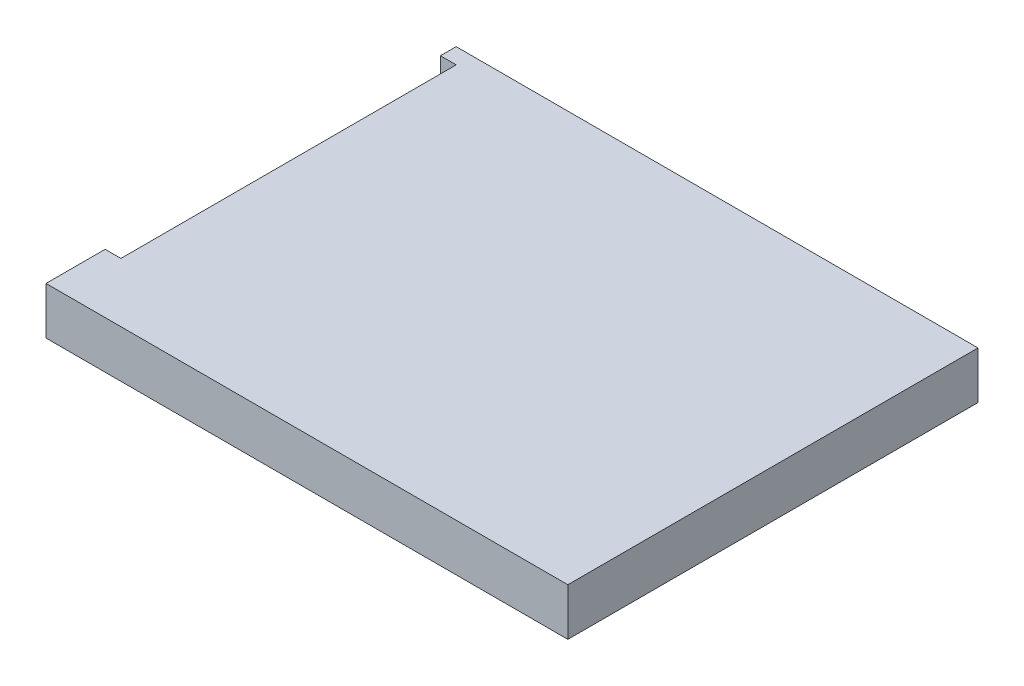
ISO-10303-21;
HEADER;
FILE_DESCRIPTION(('STEP AP214'),'2;1');
FILE_NAME('part.step','',(''),(''),'','','');
FILE_SCHEMA(('AUTOMOTIVE_DESIGN { 1 0 10303 214 1 1 1 1 }'));
ENDSEC;
DATA;
#1=APPLICATION_CONTEXT('core data for automotive mechanical design processes');
#2=APPLICATION_PROTOCOL_DEFINITION('international standard','automotive_design',2000,#1);
#3=PRODUCT_CONTEXT('',#1,'mechanical');
#4=PRODUCT('Part','Part','',(#3));
#5=PRODUCT_RELATED_PRODUCT_CATEGORY('part','',(#4));
#6=PRODUCT_DEFINITION_FORMATION('','',#4);
#7=PRODUCT_DEFINITION_CONTEXT('part definition',#1,'design');
#8=PRODUCT_DEFINITION('design','',#6,#7);
#9=PRODUCT_DEFINITION_SHAPE('','',#8);
#10=(LENGTH_UNIT() NAMED_UNIT(*) SI_UNIT(.MILLI.,.METRE.));
#11=(NAMED_UNIT(*) PLANE_ANGLE_UNIT() SI_UNIT($,.RADIAN.));
#12=(NAMED_UNIT(*) SI_UNIT($,.STERADIAN.) SOLID_ANGLE_UNIT());
#13=UNCERTAINTY_MEASURE_WITH_UNIT(LENGTH_MEASURE(1.E-05),#10,'distance_accuracy_value','');
#14=(GEOMETRIC_REPRESENTATION_CONTEXT(3) GLOBAL_UNCERTAINTY_ASSIGNED_CONTEXT((#13)) GLOBAL_UNIT_ASSIGNED_CONTEXT((#10,
#11,#12)) REPRESENTATION_CONTEXT('',''));
#15=CARTESIAN_POINT('',(0.,0.,0.));
#16=DIRECTION('',(0.,0.,1.));
#17=DIRECTION('',(1.,0.,0.));
#18=AXIS2_PLACEMENT_3D('',#15,#16,#17);
#19=CARTESIAN_POINT('',(-108.065698362609,19.05,-72.5277108433735));
#20=DIRECTION('',(1.,0.,0.));
#21=DIRECTION('',(0.,0.,-1.));
#22=AXIS2_PLACEMENT_3D('',#19,#20,#21);
#23=PLANE('',#22);
#24=DIRECTION('',(0.,0.,1.));
#25=VECTOR('',#24,1.);
#26=CARTESIAN_POINT('',(-108.065698362609,6.35,-66.1777108433735));
#27=LINE('',#26,#25);
#28=CARTESIAN_POINT('',(-108.065698362609,6.35,-66.1777108433735));
#29=VERTEX_POINT('',#28);
#30=CARTESIAN_POINT('',(-108.065698362609,6.35,68.7724891566264));
#31=VERTEX_POINT('',#30);
#32=EDGE_CURVE('E115',#29,#31,#27,.T.);
#33=ORIENTED_EDGE('',*,*,#32,.F.);
#34=DIRECTION('',(0.,1.,0.));
#35=VECTOR('',#34,1.);
#36=CARTESIAN_POINT('',(-108.065698362609,6.35,-66.1777108433735));
#37=LINE('',#36,#35);
#38=CARTESIAN_POINT('',(-108.065698362609,19.05,-66.1777108433735));
#39=VERTEX_POINT('',#38);
#40=EDGE_CURVE('E145',#29,#39,#37,.T.);
#41=ORIENTED_EDGE('',*,*,#40,.T.);
#42=DIRECTION('',(0.,0.,1.));
#43=VECTOR('',#42,1.);
#44=CARTESIAN_POINT('',(-108.065698362609,19.05,-72.5277108433735));
#45=LINE('',#44,#43);
#46=CARTESIAN_POINT('',(-108.065698362609,19.05,-72.5277108433735));
#47=VERTEX_POINT('',#46);
#48=EDGE_CURVE('E133',#47,#39,#45,.T.);
#49=ORIENTED_EDGE('',*,*,#48,.F.);
#50=DIRECTION('',(0.,-1.,0.));
#51=VECTOR('',#50,1.);
#52=CARTESIAN_POINT('',(-108.065698362609,19.05,-72.5277108433735));
#53=LINE('',#52,#51);
#54=CARTESIAN_POINT('',(-108.065698362609,0.,-72.5277108433735));
#55=VERTEX_POINT('',#54);
#56=EDGE_CURVE('E140',#47,#55,#53,.T.);
#57=ORIENTED_EDGE('',*,*,#56,.T.);
#58=DIRECTION('',(0.,0.,1.));
#59=VECTOR('',#58,1.);
#60=CARTESIAN_POINT('',(-108.065698362609,0.,-72.5277108433735));
#61=LINE('',#60,#59);
#62=CARTESIAN_POINT('',(-108.065698362609,0.,92.5722891566265));
#63=VERTEX_POINT('',#62);
#64=EDGE_CURVE('E141',#55,#63,#61,.T.);
#65=ORIENTED_EDGE('',*,*,#64,.T.);
#66=DIRECTION('',(0.,-1.,0.));
#67=VECTOR('',#66,1.);
#68=CARTESIAN_POINT('',(-108.065698362609,19.05,92.5722891566265));
#69=LINE('',#68,#67);
#70=CARTESIAN_POINT('',(-108.065698362609,19.05,92.5722891566265));
#71=VERTEX_POINT('',#70);
#72=EDGE_CURVE('E11',#71,#63,#69,.T.);
#73=ORIENTED_EDGE('',*,*,#72,.F.);
#74=CARTESIAN_POINT('',(-108.065698362609,19.05,68.7724891566264));
#75=VERTEX_POINT('',#74);
#76=EDGE_CURVE('E85',#75,#71,#45,.T.);
#77=ORIENTED_EDGE('',*,*,#76,.F.);
#78=DIRECTION('',(0.,1.,0.));
#79=VECTOR('',#78,1.);
#80=CARTESIAN_POINT('',(-108.065698362609,6.35,68.7724891566264));
#81=LINE('',#80,#79);
#82=EDGE_CURVE('E49',#31,#75,#81,.T.);
#83=ORIENTED_EDGE('',*,*,#82,.F.);
#84=EDGE_LOOP('',(#33,#41,#49,#57,#65,#73,#77,#83));
#85=FACE_BOUND('',#84,.T.);
#86=ADVANCED_FACE('F35',(#85),#23,.F.);
#87=CARTESIAN_POINT('',(-108.065698362609,19.05,92.5722891566265));
#88=DIRECTION('',(0.,0.,-1.));
#89=DIRECTION('',(-1.,0.,0.));
#90=AXIS2_PLACEMENT_3D('',#87,#88,#89);
#91=PLANE('',#90);
#92=DIRECTION('',(1.,0.,0.));
#93=VECTOR('',#92,1.);
#94=CARTESIAN_POINT('',(-108.065698362609,0.,92.5722891566265));
#95=LINE('',#94,#93);
#96=CARTESIAN_POINT('',(101.992301637391,0.,92.5722891566265));
#97=VERTEX_POINT('',#96);
#98=EDGE_CURVE('E144',#63,#97,#95,.T.);
#99=ORIENTED_EDGE('',*,*,#98,.T.);
#100=DIRECTION('',(0.,-1.,0.));
#101=VECTOR('',#100,1.);
#102=CARTESIAN_POINT('',(101.992301637391,19.05,92.5722891566265));
#103=LINE('',#102,#101);
#104=CARTESIAN_POINT('',(101.992301637391,19.05,92.5722891566265));
#105=VERTEX_POINT('',#104);
#106=EDGE_CURVE('E42',#105,#97,#103,.T.);
#107=ORIENTED_EDGE('',*,*,#106,.F.);
#108=DIRECTION('',(1.,0.,0.));
#109=VECTOR('',#108,1.);
#110=CARTESIAN_POINT('',(-108.065698362609,19.05,92.5722891566265));
#111=LINE('',#110,#109);
#112=EDGE_CURVE('E135',#71,#105,#111,.T.);
#113=ORIENTED_EDGE('',*,*,#112,.F.);
#114=ORIENTED_EDGE('',*,*,#72,.T.);
#115=EDGE_LOOP('',(#99,#107,#113,#114));
#116=FACE_BOUND('',#115,.T.);
#117=ADVANCED_FACE('F173',(#116),#91,.F.);
#118=CARTESIAN_POINT('',(101.992301637391,19.05,-72.5277108433735));
#119=DIRECTION('',(-1.,0.,0.));
#120=DIRECTION('',(0.,0.,1.));
#121=AXIS2_PLACEMENT_3D('',#118,#119,#120);
#122=PLANE('',#121);
#123=DIRECTION('',(0.,0.,-1.));
#124=VECTOR('',#123,1.);
#125=CARTESIAN_POINT('',(101.992301637391,0.,-72.5277108433735));
#126=LINE('',#125,#124);
#127=CARTESIAN_POINT('',(101.992301637391,0.,-72.5277108433735));
#128=VERTEX_POINT('',#127);
#129=EDGE_CURVE('E147',#97,#128,#126,.T.);
#130=ORIENTED_EDGE('',*,*,#129,.T.);
#131=DIRECTION('',(0.,-1.,0.));
#132=VECTOR('',#131,1.);
#133=CARTESIAN_POINT('',(101.992301637391,19.05,-72.5277108433735));
#134=LINE('',#133,#132);
#135=CARTESIAN_POINT('',(101.992301637391,19.05,-72.5277108433735));
#136=VERTEX_POINT('',#135);
#137=EDGE_CURVE('E151',#136,#128,#134,.T.);
#138=ORIENTED_EDGE('',*,*,#137,.F.);
#139=DIRECTION('',(0.,0.,-1.));
#140=VECTOR('',#139,1.);
#141=CARTESIAN_POINT('',(101.992301637391,19.05,-72.5277108433735));
#142=LINE('',#141,#140);
#143=EDGE_CURVE('E137',#105,#136,#142,.T.);
#144=ORIENTED_EDGE('',*,*,#143,.F.);
#145=ORIENTED_EDGE('',*,*,#106,.T.);
#146=EDGE_LOOP('',(#130,#138,#144,#145));
#147=FACE_BOUND('',#146,.T.);
#148=ADVANCED_FACE('F157',(#147),#122,.F.);
#149=CARTESIAN_POINT('',(-108.065698362609,19.05,-72.5277108433735));
#150=DIRECTION('',(0.,0.,1.));
#151=DIRECTION('',(1.,0.,0.));
#152=AXIS2_PLACEMENT_3D('',#149,#150,#151);
#153=PLANE('',#152);
#154=DIRECTION('',(-1.,0.,0.));
#155=VECTOR('',#154,1.);
#156=CARTESIAN_POINT('',(-108.065698362609,0.,-72.5277108433735));
#157=LINE('',#156,#155);
#158=EDGE_CURVE('E79',#128,#55,#157,.T.);
#159=ORIENTED_EDGE('',*,*,#158,.T.);
#160=ORIENTED_EDGE('',*,*,#56,.F.);
#161=DIRECTION('',(-1.,0.,0.));
#162=VECTOR('',#161,1.);
#163=CARTESIAN_POINT('',(-108.065698362609,19.05,-72.5277108433735));
#164=LINE('',#163,#162);
#165=EDGE_CURVE('E58',#136,#47,#164,.T.);
#166=ORIENTED_EDGE('',*,*,#165,.F.);
#167=ORIENTED_EDGE('',*,*,#137,.T.);
#168=EDGE_LOOP('',(#159,#160,#166,#167));
#169=FACE_BOUND('',#168,.T.);
#170=ADVANCED_FACE('F164',(#169),#153,.F.);
#171=CARTESIAN_POINT('',(0.,19.05,0.));
#172=DIRECTION('',(0.,1.,0.));
#173=DIRECTION('',(0.,0.,1.));
#174=AXIS2_PLACEMENT_3D('',#171,#172,#173);
#175=PLANE('',#174);
#176=DIRECTION('',(-1.,0.,0.));
#177=VECTOR('',#176,1.);
#178=CARTESIAN_POINT('',(-108.065698362609,19.05,-66.1777108433735));
#179=LINE('',#178,#177);
#180=CARTESIAN_POINT('',(-101.715698362609,19.05,-66.1777108433735));
#181=VERTEX_POINT('',#180);
#182=EDGE_CURVE('E124',#181,#39,#179,.T.);
#183=ORIENTED_EDGE('',*,*,#182,.F.);
#184=DIRECTION('',(0.,0.,-1.));
#185=VECTOR('',#184,1.);
#186=CARTESIAN_POINT('',(-101.715698362609,19.05,-66.1777108433735));
#187=LINE('',#186,#185);
#188=CARTESIAN_POINT('',(-101.715698362609,19.05,68.7724891566264));
#189=VERTEX_POINT('',#188);
#190=EDGE_CURVE('E185',#189,#181,#187,.T.);
#191=ORIENTED_EDGE('',*,*,#190,.F.);
#192=DIRECTION('',(1.,0.,0.));
#193=VECTOR('',#192,1.);
#194=CARTESIAN_POINT('',(-108.065698362609,19.05,68.7724891566264));
#195=LINE('',#194,#193);
#196=EDGE_CURVE('E188',#75,#189,#195,.T.);
#197=ORIENTED_EDGE('',*,*,#196,.F.);
#198=ORIENTED_EDGE('',*,*,#76,.T.);
#199=ORIENTED_EDGE('',*,*,#112,.T.);
#200=ORIENTED_EDGE('',*,*,#143,.T.);
#201=ORIENTED_EDGE('',*,*,#165,.T.);
#202=ORIENTED_EDGE('',*,*,#48,.T.);
#203=EDGE_LOOP('',(#183,#191,#197,#198,#199,#200,#201,#202));
#204=FACE_BOUND('',#203,.T.);
#205=ADVANCED_FACE('F166',(#204),#175,.T.);
#206=CARTESIAN_POINT('',(0.,0.,0.));
#207=DIRECTION('',(0.,1.,0.));
#208=DIRECTION('',(0.,0.,1.));
#209=AXIS2_PLACEMENT_3D('',#206,#207,#208);
#210=PLANE('',#209);
#211=ORIENTED_EDGE('',*,*,#64,.F.);
#212=ORIENTED_EDGE('',*,*,#158,.F.);
#213=ORIENTED_EDGE('',*,*,#129,.F.);
#214=ORIENTED_EDGE('',*,*,#98,.F.);
#215=EDGE_LOOP('',(#211,#212,#213,#214));
#216=FACE_BOUND('',#215,.T.);
#217=ADVANCED_FACE('F162',(#216),#210,.F.);
#218=CARTESIAN_POINT('',(-108.065698362609,6.35,-66.1777108433735));
#219=DIRECTION('',(0.,0.,-1.));
#220=DIRECTION('',(-1.,0.,0.));
#221=AXIS2_PLACEMENT_3D('',#218,#219,#220);
#222=PLANE('',#221);
#223=ORIENTED_EDGE('',*,*,#182,.T.);
#224=ORIENTED_EDGE('',*,*,#40,.F.);
#225=DIRECTION('',(-1.,0.,0.));
#226=VECTOR('',#225,1.);
#227=CARTESIAN_POINT('',(-108.065698362609,6.35,-66.1777108433735));
#228=LINE('',#227,#226);
#229=CARTESIAN_POINT('',(-101.715698362609,6.35,-66.1777108433735));
#230=VERTEX_POINT('',#229);
#231=EDGE_CURVE('E121',#230,#29,#228,.T.);
#232=ORIENTED_EDGE('',*,*,#231,.F.);
#233=DIRECTION('',(0.,1.,0.));
#234=VECTOR('',#233,1.);
#235=CARTESIAN_POINT('',(-101.715698362609,6.35,-66.1777108433735));
#236=LINE('',#235,#234);
#237=EDGE_CURVE('E128',#230,#181,#236,.T.);
#238=ORIENTED_EDGE('',*,*,#237,.T.);
#239=EDGE_LOOP('',(#223,#224,#232,#238));
#240=FACE_BOUND('',#239,.T.);
#241=ADVANCED_FACE('F192',(#240),#222,.F.);
#242=CARTESIAN_POINT('',(-101.715698362609,6.35,-66.1777108433735));
#243=DIRECTION('',(1.,0.,0.));
#244=DIRECTION('',(0.,0.,-1.));
#245=AXIS2_PLACEMENT_3D('',#242,#243,#244);
#246=PLANE('',#245);
#247=ORIENTED_EDGE('',*,*,#190,.T.);
#248=ORIENTED_EDGE('',*,*,#237,.F.);
#249=DIRECTION('',(0.,0.,-1.));
#250=VECTOR('',#249,1.);
#251=CARTESIAN_POINT('',(-101.715698362609,6.35,-66.1777108433735));
#252=LINE('',#251,#250);
#253=CARTESIAN_POINT('',(-101.715698362609,6.35,68.7724891566264));
#254=VERTEX_POINT('',#253);
#255=EDGE_CURVE('E114',#254,#230,#252,.T.);
#256=ORIENTED_EDGE('',*,*,#255,.F.);
#257=DIRECTION('',(0.,1.,0.));
#258=VECTOR('',#257,1.);
#259=CARTESIAN_POINT('',(-101.715698362609,6.35,68.7724891566264));
#260=LINE('',#259,#258);
#261=EDGE_CURVE('E110',#254,#189,#260,.T.);
#262=ORIENTED_EDGE('',*,*,#261,.T.);
#263=EDGE_LOOP('',(#247,#248,#256,#262));
#264=FACE_BOUND('',#263,.T.);
#265=ADVANCED_FACE('F194',(#264),#246,.F.);
#266=CARTESIAN_POINT('',(-108.065698362609,6.35,68.7724891566264));
#267=DIRECTION('',(0.,0.,1.));
#268=DIRECTION('',(1.,0.,0.));
#269=AXIS2_PLACEMENT_3D('',#266,#267,#268);
#270=PLANE('',#269);
#271=ORIENTED_EDGE('',*,*,#196,.T.);
#272=ORIENTED_EDGE('',*,*,#261,.F.);
#273=DIRECTION('',(1.,0.,0.));
#274=VECTOR('',#273,1.);
#275=CARTESIAN_POINT('',(-108.065698362609,6.35,68.7724891566264));
#276=LINE('',#275,#274);
#277=EDGE_CURVE('E107',#31,#254,#276,.T.);
#278=ORIENTED_EDGE('',*,*,#277,.F.);
#279=ORIENTED_EDGE('',*,*,#82,.T.);
#280=EDGE_LOOP('',(#271,#272,#278,#279));
#281=FACE_BOUND('',#280,.T.);
#282=ADVANCED_FACE('F109',(#281),#270,.F.);
#283=CARTESIAN_POINT('',(0.,6.35,0.));
#284=DIRECTION('',(0.,1.,0.));
#285=DIRECTION('',(0.,0.,1.));
#286=AXIS2_PLACEMENT_3D('',#283,#284,#285);
#287=PLANE('',#286);
#288=ORIENTED_EDGE('',*,*,#32,.T.);
#289=ORIENTED_EDGE('',*,*,#277,.T.);
#290=ORIENTED_EDGE('',*,*,#255,.T.);
#291=ORIENTED_EDGE('',*,*,#231,.T.);
#292=EDGE_LOOP('',(#288,#289,#290,#291));
#293=FACE_BOUND('',#292,.T.);
#294=ADVANCED_FACE('F119',(#293),#287,.T.);
#295=CLOSED_SHELL('',(#86,#117,#148,#170,#205,#217,#241,#265,#282,#294));
#296=MANIFOLD_SOLID_BREP('B2',#295);
#297=ADVANCED_BREP_SHAPE_REPRESENTATION('',(#18,#296),#14);
#298=SHAPE_DEFINITION_REPRESENTATION(#9,#297);
ENDSEC;
END-ISO-10303-21;
